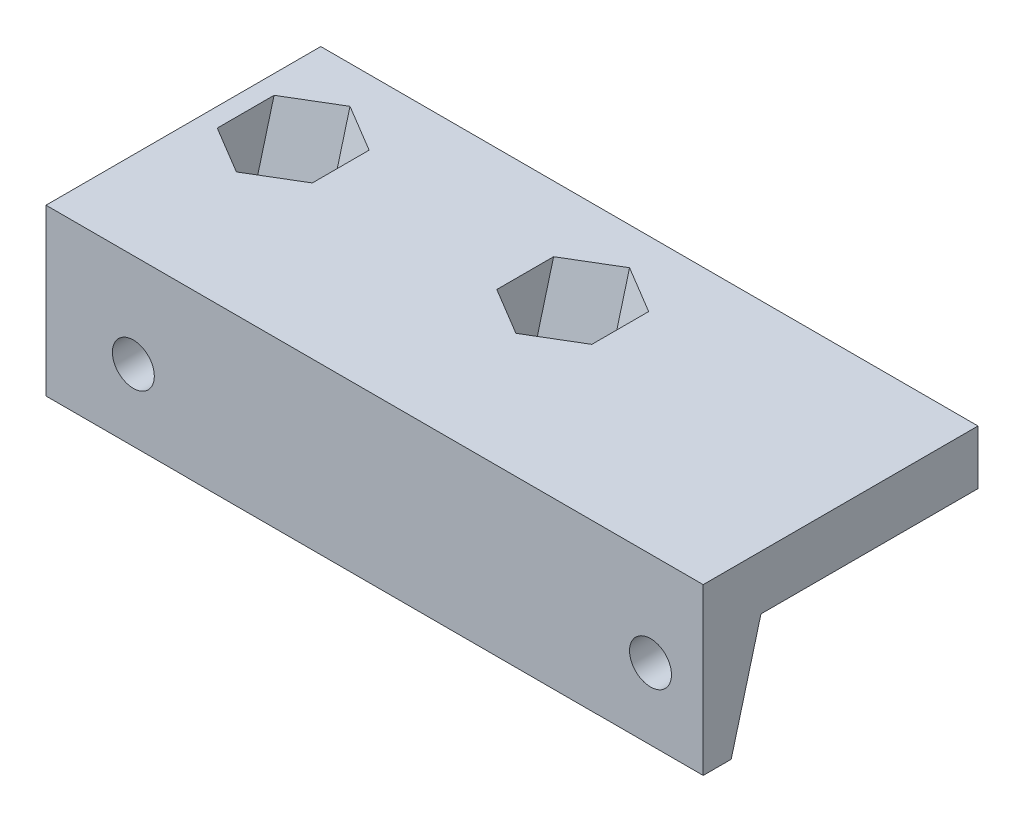
ISO-10303-21;
HEADER;
FILE_DESCRIPTION(('STEP AP214'),'2;1');
FILE_NAME('part.step','',(''),(''),'','','');
FILE_SCHEMA(('AUTOMOTIVE_DESIGN { 1 0 10303 214 1 1 1 1 }'));
ENDSEC;
DATA;
#1=APPLICATION_CONTEXT('core data for automotive mechanical design processes');
#2=APPLICATION_PROTOCOL_DEFINITION('international standard','automotive_design',2000,#1);
#3=PRODUCT_CONTEXT('',#1,'mechanical');
#4=PRODUCT('Part','Part','',(#3));
#5=PRODUCT_RELATED_PRODUCT_CATEGORY('part','',(#4));
#6=PRODUCT_DEFINITION_FORMATION('','',#4);
#7=PRODUCT_DEFINITION_CONTEXT('part definition',#1,'design');
#8=PRODUCT_DEFINITION('design','',#6,#7);
#9=PRODUCT_DEFINITION_SHAPE('','',#8);
#10=(LENGTH_UNIT() NAMED_UNIT(*) SI_UNIT(.MILLI.,.METRE.));
#11=(NAMED_UNIT(*) PLANE_ANGLE_UNIT() SI_UNIT($,.RADIAN.));
#12=(NAMED_UNIT(*) SI_UNIT($,.STERADIAN.) SOLID_ANGLE_UNIT());
#13=UNCERTAINTY_MEASURE_WITH_UNIT(LENGTH_MEASURE(1.E-05),#10,'distance_accuracy_value','');
#14=(GEOMETRIC_REPRESENTATION_CONTEXT(3) GLOBAL_UNCERTAINTY_ASSIGNED_CONTEXT((#13)) GLOBAL_UNIT_ASSIGNED_CONTEXT((#10,
#11,#12)) REPRESENTATION_CONTEXT('',''));
#15=CARTESIAN_POINT('',(0.,0.,0.));
#16=DIRECTION('',(0.,0.,1.));
#17=DIRECTION('',(1.,0.,0.));
#18=AXIS2_PLACEMENT_3D('',#15,#16,#17);
#19=CARTESIAN_POINT('',(-34.7500000000001,10.2662464495213,-12.2025071457582));
#20=DIRECTION('',(0.,-0.965925826289068,0.25881904510252));
#21=DIRECTION('',(0.,0.25881904510252,0.965925826289068));
#22=AXIS2_PLACEMENT_3D('',#19,#20,#21);
#23=CYLINDRICAL_SURFACE('',#22,2.);
#24=CARTESIAN_POINT('',(-34.75,-0.975363448323253,-9.190326852005));
#25=DIRECTION('',(0.,-0.965925826289068,0.25881904510252));
#26=DIRECTION('',(0.,-0.25881904510252,-0.965925826289068));
#27=AXIS2_PLACEMENT_3D('',#24,#25,#26);
#28=CIRCLE('',#27,2.);
#29=CARTESIAN_POINT('',(-34.75,-1.49300153852829,-11.1221785045831));
#30=VERTEX_POINT('',#29);
#31=EDGE_CURVE('E377',#30,#30,#28,.T.);
#32=ORIENTED_EDGE('',*,*,#31,.T.);
#33=EDGE_LOOP('',(#32));
#34=FACE_BOUND('',#33,.T.);
#35=CARTESIAN_POINT('',(-34.7500000000001,3.33145055141853,-10.3443341851869));
#36=DIRECTION('',(0.,-0.965925826289068,0.25881904510252));
#37=DIRECTION('',(0.,-0.25881904510252,-0.965925826289068));
#38=AXIS2_PLACEMENT_3D('',#35,#36,#37);
#39=CIRCLE('',#38,2.);
#40=CARTESIAN_POINT('',(-34.7500000000001,2.81381246121349,-12.276185837765));
#41=VERTEX_POINT('',#40);
#42=EDGE_CURVE('E312',#41,#41,#39,.T.);
#43=ORIENTED_EDGE('',*,*,#42,.F.);
#44=EDGE_LOOP('',(#43));
#45=FACE_BOUND('',#44,.T.);
#46=ADVANCED_FACE('F39',(#34,#45),#23,.F.);
#47=CARTESIAN_POINT('',(-14.7500000000001,10.2662464495213,-12.2025071457582));
#48=DIRECTION('',(0.,-0.965925826289068,0.25881904510252));
#49=DIRECTION('',(0.,0.25881904510252,0.965925826289068));
#50=AXIS2_PLACEMENT_3D('',#47,#48,#49);
#51=CYLINDRICAL_SURFACE('',#50,2.);
#52=CARTESIAN_POINT('',(-14.7500000000001,-0.975363448323243,-9.190326852005));
#53=DIRECTION('',(0.,-0.965925826289068,0.25881904510252));
#54=DIRECTION('',(0.,-0.25881904510252,-0.965925826289068));
#55=AXIS2_PLACEMENT_3D('',#52,#53,#54);
#56=CIRCLE('',#55,2.);
#57=CARTESIAN_POINT('',(-14.7500000000001,-1.49300153852828,-11.1221785045831));
#58=VERTEX_POINT('',#57);
#59=EDGE_CURVE('E380',#58,#58,#56,.T.);
#60=ORIENTED_EDGE('',*,*,#59,.T.);
#61=EDGE_LOOP('',(#60));
#62=FACE_BOUND('',#61,.T.);
#63=CARTESIAN_POINT('',(-14.7500000000001,3.33145055141854,-10.3443341851869));
#64=DIRECTION('',(0.,-0.965925826289068,0.25881904510252));
#65=DIRECTION('',(0.,-0.25881904510252,-0.965925826289068));
#66=AXIS2_PLACEMENT_3D('',#63,#64,#65);
#67=CIRCLE('',#66,2.);
#68=CARTESIAN_POINT('',(-14.7500000000001,2.8138124612135,-12.276185837765));
#69=VERTEX_POINT('',#68);
#70=EDGE_CURVE('E300',#69,#69,#67,.T.);
#71=ORIENTED_EDGE('',*,*,#70,.F.);
#72=EDGE_LOOP('',(#71));
#73=FACE_BOUND('',#72,.T.);
#74=ADVANCED_FACE('F441',(#62,#73),#51,.F.);
#75=CARTESIAN_POINT('',(-10.,12.2073892877902,-4.95806344859015));
#76=DIRECTION('',(0.,-0.25881904510252,-0.965925826289068));
#77=DIRECTION('',(0.,-0.965925826289068,0.25881904510252));
#78=AXIS2_PLACEMENT_3D('',#75,#76,#77);
#79=PLANE('',#78);
#80=CARTESIAN_POINT('',(3.74999999999994,6.27312353150435,-3.36798173152168));
#81=DIRECTION('',(0.,0.25881904510252,0.965925826289068));
#82=DIRECTION('',(0.,0.965925826289068,-0.25881904510252));
#83=AXIS2_PLACEMENT_3D('',#80,#81,#82);
#84=ELLIPSE('',#83,1.55291427061512,1.5);
#85=CARTESIAN_POINT('',(3.74999999999994,7.77312353150435,-3.76990552016836));
#86=VERTEX_POINT('',#85);
#87=EDGE_CURVE('E227',#86,#86,#84,.T.);
#88=ORIENTED_EDGE('',*,*,#87,.T.);
#89=EDGE_LOOP('',(#88));
#90=FACE_BOUND('',#89,.T.);
#91=DIRECTION('',(0.,-0.965925826289068,0.25881904510252));
#92=VECTOR('',#91,1.);
#93=CARTESIAN_POINT('',(7.51920912370846,-0.421775836808597,-1.5740888523746));
#94=LINE('',#93,#92);
#95=CARTESIAN_POINT('',(7.51920912370846,9.11771432346218,-4.13018753702379));
#96=VERTEX_POINT('',#95);
#97=CARTESIAN_POINT('',(7.51920912370846,1.17463517425132,-2.00184589357625));
#98=VERTEX_POINT('',#97);
#99=EDGE_CURVE('E329',#96,#98,#94,.T.);
#100=ORIENTED_EDGE('',*,*,#99,.T.);
#101=DIRECTION('',(-1.,0.,0.));
#102=VECTOR('',#101,1.);
#103=CARTESIAN_POINT('',(7.51920912370846,1.17463517425132,-2.00184589357625));
#104=LINE('',#103,#102);
#105=CARTESIAN_POINT('',(0.,1.17463517425132,-2.00184589357625));
#106=VERTEX_POINT('',#105);
#107=EDGE_CURVE('E326',#98,#106,#104,.T.);
#108=ORIENTED_EDGE('',*,*,#107,.T.);
#109=DIRECTION('',(0.,0.965925826289068,-0.25881904510252));
#110=VECTOR('',#109,1.);
#111=CARTESIAN_POINT('',(-5.99684705083167E-13,14.5521810124452,-5.58634849763062));
#112=LINE('',#111,#110);
#113=CARTESIAN_POINT('',(0.,1.16774620563937,-2.));
#114=VERTEX_POINT('',#113);
#115=EDGE_CURVE('E405',#114,#106,#112,.T.);
#116=ORIENTED_EDGE('',*,*,#115,.F.);
#117=DIRECTION('',(1.,0.,0.));
#118=VECTOR('',#117,1.);
#119=CARTESIAN_POINT('',(0.,1.16774620563937,-2.));
#120=LINE('',#119,#118);
#121=CARTESIAN_POINT('',(-10.,1.16774620563937,-2.));
#122=VERTEX_POINT('',#121);
#123=EDGE_CURVE('E418',#122,#114,#120,.T.);
#124=ORIENTED_EDGE('',*,*,#123,.F.);
#125=DIRECTION('',(0.,-0.965925826289068,0.25881904510252));
#126=VECTOR('',#125,1.);
#127=CARTESIAN_POINT('',(-10.,12.2073892877902,-4.95806344859015));
#128=LINE('',#127,#126);
#129=CARTESIAN_POINT('',(-10.,9.11771432346219,-4.13018753702379));
#130=VERTEX_POINT('',#129);
#131=EDGE_CURVE('E402',#130,#122,#128,.T.);
#132=ORIENTED_EDGE('',*,*,#131,.F.);
#133=DIRECTION('',(-1.,0.,0.));
#134=VECTOR('',#133,1.);
#135=CARTESIAN_POINT('',(23.5262830368964,9.11771432346221,-4.1301875370238));
#136=LINE('',#135,#134);
#137=EDGE_CURVE('E314',#96,#130,#136,.T.);
#138=ORIENTED_EDGE('',*,*,#137,.F.);
#139=EDGE_LOOP('',(#100,#108,#116,#124,#132,#138));
#140=FACE_BOUND('',#139,.T.);
#141=ADVANCED_FACE('F447',(#90,#140),#79,.T.);
#142=CARTESIAN_POINT('',(-10.,12.2073892877902,-4.95806344859015));
#143=DIRECTION('',(-1.,0.,0.));
#144=DIRECTION('',(0.,-1.,0.));
#145=AXIS2_PLACEMENT_3D('',#142,#143,#144);
#146=PLANE('',#145);
#147=DIRECTION('',(0.,0.,1.));
#148=VECTOR('',#147,1.);
#149=CARTESIAN_POINT('',(-10.,9.11771432346219,-4.95806344859015));
#150=LINE('',#149,#148);
#151=CARTESIAN_POINT('',(-10.,9.11771432346219,-19.659330243175));
#152=VERTEX_POINT('',#151);
#153=EDGE_CURVE('E308',#152,#130,#150,.T.);
#154=ORIENTED_EDGE('',*,*,#153,.T.);
#155=ORIENTED_EDGE('',*,*,#131,.T.);
#156=CARTESIAN_POINT('',(-10.,0.965779389945662,-1.94588315483698));
#157=VERTEX_POINT('',#156);
#158=EDGE_CURVE('E401',#122,#157,#128,.T.);
#159=ORIENTED_EDGE('',*,*,#158,.T.);
#160=DIRECTION('',(0.,0.25881904510252,0.965925826289068));
#161=VECTOR('',#160,1.);
#162=CARTESIAN_POINT('',(-10.,0.965779389945662,-1.94588315483698));
#163=LINE('',#162,#161);
#164=CARTESIAN_POINT('',(-10.,-2.91650628659214,-16.434770549173));
#165=VERTEX_POINT('',#164);
#166=EDGE_CURVE('E383',#165,#157,#163,.T.);
#167=ORIENTED_EDGE('',*,*,#166,.F.);
#168=DIRECTION('',(0.,-0.965925826289068,0.25881904510252));
#169=VECTOR('',#168,1.);
#170=CARTESIAN_POINT('',(-10.,8.32510361125244,-19.4469508429262));
#171=LINE('',#170,#169);
#172=EDGE_CURVE('E392',#152,#165,#171,.T.);
#173=ORIENTED_EDGE('',*,*,#172,.F.);
#174=EDGE_LOOP('',(#154,#155,#159,#167,#173));
#175=FACE_BOUND('',#174,.T.);
#176=ADVANCED_FACE('F471',(#175),#146,.F.);
#177=CARTESIAN_POINT('',(3.74999999999994,6.27312353150435,0.));
#178=DIRECTION('',(0.,0.,1.));
#179=DIRECTION('',(-1.,0.,0.));
#180=AXIS2_PLACEMENT_3D('',#177,#178,#179);
#181=PLANE('',#180);
#182=CARTESIAN_POINT('',(3.74999999999994,6.27312353150435,0.));
#183=DIRECTION('',(0.,0.,-1.));
#184=DIRECTION('',(-1.,0.,0.));
#185=AXIS2_PLACEMENT_3D('',#182,#183,#184);
#186=CIRCLE('',#185,1.5);
#187=CARTESIAN_POINT('',(2.24999999999994,6.27312353150435,0.));
#188=VERTEX_POINT('',#187);
#189=EDGE_CURVE('E43',#188,#188,#186,.T.);
#190=ORIENTED_EDGE('',*,*,#189,.T.);
#191=EDGE_LOOP('',(#190));
#192=FACE_BOUND('',#191,.T.);
#193=DIRECTION('',(0.,-1.,0.));
#194=VECTOR('',#193,1.);
#195=CARTESIAN_POINT('',(-29.5000000000001,1.16774620563936,0.));
#196=LINE('',#195,#194);
#197=CARTESIAN_POINT('',(-29.5000000000001,1.1746351742513,0.));
#198=VERTEX_POINT('',#197);
#199=CARTESIAN_POINT('',(-29.5000000000001,1.16774620563936,0.));
#200=VERTEX_POINT('',#199);
#201=EDGE_CURVE('E421',#198,#200,#196,.T.);
#202=ORIENTED_EDGE('',*,*,#201,.T.);
#203=DIRECTION('',(1.,0.,0.));
#204=VECTOR('',#203,1.);
#205=CARTESIAN_POINT('',(0.,1.16774620563937,0.));
#206=LINE('',#205,#204);
#207=CARTESIAN_POINT('',(0.,1.16774620563937,0.));
#208=VERTEX_POINT('',#207);
#209=EDGE_CURVE('E424',#200,#208,#206,.T.);
#210=ORIENTED_EDGE('',*,*,#209,.T.);
#211=DIRECTION('',(0.,1.,0.));
#212=VECTOR('',#211,1.);
#213=CARTESIAN_POINT('',(0.,2.52312353150435,0.));
#214=LINE('',#213,#212);
#215=CARTESIAN_POINT('',(0.,1.17463517425132,0.));
#216=VERTEX_POINT('',#215);
#217=EDGE_CURVE('E427',#208,#216,#214,.T.);
#218=ORIENTED_EDGE('',*,*,#217,.T.);
#219=DIRECTION('',(-1.,0.,0.));
#220=VECTOR('',#219,1.);
#221=CARTESIAN_POINT('',(7.51920912370846,1.17463517425132,0.));
#222=LINE('',#221,#220);
#223=CARTESIAN_POINT('',(7.51920912370846,1.17463517425132,0.));
#224=VERTEX_POINT('',#223);
#225=EDGE_CURVE('E321',#224,#216,#222,.T.);
#226=ORIENTED_EDGE('',*,*,#225,.F.);
#227=DIRECTION('',(0.,-1.,0.));
#228=VECTOR('',#227,1.);
#229=CARTESIAN_POINT('',(7.51920912370846,0.,0.));
#230=LINE('',#229,#228);
#231=CARTESIAN_POINT('',(7.51920912370845,13.,0.));
#232=VERTEX_POINT('',#231);
#233=EDGE_CURVE('E320',#232,#224,#230,.T.);
#234=ORIENTED_EDGE('',*,*,#233,.F.);
#235=DIRECTION('',(-1.,0.,0.));
#236=VECTOR('',#235,1.);
#237=CARTESIAN_POINT('',(-29.5000000000001,13.,0.));
#238=LINE('',#237,#236);
#239=CARTESIAN_POINT('',(-39.5000000000001,13.,0.));
#240=VERTEX_POINT('',#239);
#241=EDGE_CURVE('E414',#232,#240,#238,.T.);
#242=ORIENTED_EDGE('',*,*,#241,.T.);
#243=DIRECTION('',(0.,-1.,0.));
#244=VECTOR('',#243,1.);
#245=CARTESIAN_POINT('',(-39.5,0.,0.));
#246=LINE('',#245,#244);
#247=CARTESIAN_POINT('',(-39.5,1.1746351742513,0.));
#248=VERTEX_POINT('',#247);
#249=EDGE_CURVE('E337',#240,#248,#246,.T.);
#250=ORIENTED_EDGE('',*,*,#249,.T.);
#251=EDGE_CURVE('E325',#198,#248,#222,.T.);
#252=ORIENTED_EDGE('',*,*,#251,.F.);
#253=EDGE_LOOP('',(#202,#210,#218,#226,#234,#242,#250,#252));
#254=FACE_BOUND('',#253,.T.);
#255=CARTESIAN_POINT('',(-33.2500000000001,6.27312353150437,0.));
#256=DIRECTION('',(0.,0.,1.));
#257=DIRECTION('',(1.,0.,0.));
#258=AXIS2_PLACEMENT_3D('',#255,#256,#257);
#259=CIRCLE('',#258,1.5);
#260=CARTESIAN_POINT('',(-31.7500000000001,6.27312353150437,0.));
#261=VERTEX_POINT('',#260);
#262=EDGE_CURVE('E411',#261,#261,#259,.T.);
#263=ORIENTED_EDGE('',*,*,#262,.F.);
#264=EDGE_LOOP('',(#263));
#265=FACE_BOUND('',#264,.T.);
#266=ADVANCED_FACE('F474',(#192,#254,#265),#181,.T.);
#267=CARTESIAN_POINT('',(-29.5000000000001,13.,-2.));
#268=DIRECTION('',(0.,-1.,0.));
#269=DIRECTION('',(1.,0.,0.));
#270=AXIS2_PLACEMENT_3D('',#267,#268,#269);
#271=PLANE('',#270);
#272=DIRECTION('',(0.,0.,-1.));
#273=VECTOR('',#272,1.);
#274=CARTESIAN_POINT('',(-11.3500000000001,13.,-2.));
#275=LINE('',#274,#273);
#276=CARTESIAN_POINT('',(-11.3500000000001,13.,-10.9027764650004));
#277=VERTEX_POINT('',#276);
#278=CARTESIAN_POINT('',(-11.3500000000001,13.,-14.9672519388289));
#279=VERTEX_POINT('',#278);
#280=EDGE_CURVE('E283',#277,#279,#275,.T.);
#281=ORIENTED_EDGE('',*,*,#280,.F.);
#282=DIRECTION('',(0.858356263574049,0.,-0.513054114868206));
#283=VECTOR('',#282,1.);
#284=CARTESIAN_POINT('',(-28.6431081799039,13.,-0.566392043900022));
#285=LINE('',#284,#283);
#286=CARTESIAN_POINT('',(-14.7500000000001,13.,-8.87053872808612));
#287=VERTEX_POINT('',#286);
#288=EDGE_CURVE('E286',#287,#277,#285,.T.);
#289=ORIENTED_EDGE('',*,*,#288,.F.);
#290=DIRECTION('',(0.858356263574049,0.,0.513054114868206));
#291=VECTOR('',#290,1.);
#292=CARTESIAN_POINT('',(-22.5917683389919,13.,-13.5576968288622));
#293=LINE('',#292,#291);
#294=CARTESIAN_POINT('',(-18.1500000000001,13.,-10.9027764650004));
#295=VERTEX_POINT('',#294);
#296=EDGE_CURVE('E289',#295,#287,#293,.T.);
#297=ORIENTED_EDGE('',*,*,#296,.F.);
#298=DIRECTION('',(0.,0.,1.));
#299=VECTOR('',#298,1.);
#300=CARTESIAN_POINT('',(-18.1500000000001,13.,-2.));
#301=LINE('',#300,#299);
#302=CARTESIAN_POINT('',(-18.1500000000001,13.,-14.9672519388289));
#303=VERTEX_POINT('',#302);
#304=EDGE_CURVE('E292',#303,#295,#301,.T.);
#305=ORIENTED_EDGE('',*,*,#304,.F.);
#306=DIRECTION('',(-0.858356263574048,0.,0.513054114868206));
#307=VECTOR('',#306,1.);
#308=CARTESIAN_POINT('',(-32.2229617169554,13.,-6.55560374137409));
#309=LINE('',#308,#307);
#310=CARTESIAN_POINT('',(-14.7500000000001,13.,-16.9994896757431));
#311=VERTEX_POINT('',#310);
#312=EDGE_CURVE('E295',#311,#303,#309,.T.);
#313=ORIENTED_EDGE('',*,*,#312,.F.);
#314=DIRECTION('',(-0.858356263574049,0.,-0.513054114868206));
#315=VECTOR('',#314,1.);
#316=CARTESIAN_POINT('',(-19.0119148019403,13.,-19.5469085263362));
#317=LINE('',#316,#315);
#318=EDGE_CURVE('E298',#279,#311,#317,.T.);
#319=ORIENTED_EDGE('',*,*,#318,.F.);
#320=EDGE_LOOP('',(#281,#289,#297,#305,#313,#319));
#321=FACE_BOUND('',#320,.T.);
#322=DIRECTION('',(0.858356263574049,0.,-0.513054114868206));
#323=VECTOR('',#322,1.);
#324=CARTESIAN_POINT('',(-33.9075986755679,13.,-9.37405630489131));
#325=LINE('',#324,#323);
#326=CARTESIAN_POINT('',(-34.7500000000001,13.,-8.87053872808613));
#327=VERTEX_POINT('',#326);
#328=CARTESIAN_POINT('',(-31.3500000000001,13.,-10.9027764650004));
#329=VERTEX_POINT('',#328);
#330=EDGE_CURVE('E249',#327,#329,#325,.T.);
#331=ORIENTED_EDGE('',*,*,#330,.F.);
#332=DIRECTION('',(0.858356263574049,0.,0.513054114868205));
#333=VECTOR('',#332,1.);
#334=CARTESIAN_POINT('',(-27.8562588346558,13.,-4.75003256787089));
#335=LINE('',#334,#333);
#336=CARTESIAN_POINT('',(-38.1500000000001,13.,-10.9027764650004));
#337=VERTEX_POINT('',#336);
#338=EDGE_CURVE('E268',#337,#327,#335,.T.);
#339=ORIENTED_EDGE('',*,*,#338,.F.);
#340=DIRECTION('',(0.,0.,1.));
#341=VECTOR('',#340,1.);
#342=CARTESIAN_POINT('',(-38.1500000000001,13.,-2.));
#343=LINE('',#342,#341);
#344=CARTESIAN_POINT('',(-38.1500000000001,13.,-14.9672519388289));
#345=VERTEX_POINT('',#344);
#346=EDGE_CURVE('E271',#345,#337,#343,.T.);
#347=ORIENTED_EDGE('',*,*,#346,.F.);
#348=DIRECTION('',(-0.858356263574048,0.,0.513054114868207));
#349=VECTOR('',#348,1.);
#350=CARTESIAN_POINT('',(-37.4874522126194,13.,-15.3632680023654));
#351=LINE('',#350,#349);
#352=CARTESIAN_POINT('',(-34.7500000000001,13.,-16.9994896757431));
#353=VERTEX_POINT('',#352);
#354=EDGE_CURVE('E274',#353,#345,#351,.T.);
#355=ORIENTED_EDGE('',*,*,#354,.F.);
#356=DIRECTION('',(-0.858356263574049,0.,-0.513054114868206));
#357=VECTOR('',#356,1.);
#358=CARTESIAN_POINT('',(-24.2764052976043,13.,-10.739244265345));
#359=LINE('',#358,#357);
#360=CARTESIAN_POINT('',(-31.3500000000001,13.,-14.9672519388289));
#361=VERTEX_POINT('',#360);
#362=EDGE_CURVE('E277',#361,#353,#359,.T.);
#363=ORIENTED_EDGE('',*,*,#362,.F.);
#364=DIRECTION('',(0.,0.,-1.));
#365=VECTOR('',#364,1.);
#366=CARTESIAN_POINT('',(-31.3500000000001,13.,-2.));
#367=LINE('',#366,#365);
#368=EDGE_CURVE('E280',#329,#361,#367,.T.);
#369=ORIENTED_EDGE('',*,*,#368,.F.);
#370=EDGE_LOOP('',(#331,#339,#347,#355,#363,#369));
#371=FACE_BOUND('',#370,.T.);
#372=ORIENTED_EDGE('',*,*,#241,.F.);
#373=DIRECTION('',(0.,0.,1.));
#374=VECTOR('',#373,1.);
#375=CARTESIAN_POINT('',(7.51920912370845,13.,0.));
#376=LINE('',#375,#374);
#377=CARTESIAN_POINT('',(7.51920912370846,13.,-19.659330243175));
#378=VERTEX_POINT('',#377);
#379=EDGE_CURVE('E324',#378,#232,#376,.T.);
#380=ORIENTED_EDGE('',*,*,#379,.F.);
#381=DIRECTION('',(-1.,0.,0.));
#382=VECTOR('',#381,1.);
#383=CARTESIAN_POINT('',(23.5262830368964,13.,-19.659330243175));
#384=LINE('',#383,#382);
#385=CARTESIAN_POINT('',(-39.5000000000001,13.,-19.659330243175));
#386=VERTEX_POINT('',#385);
#387=EDGE_CURVE('E311',#378,#386,#384,.T.);
#388=ORIENTED_EDGE('',*,*,#387,.T.);
#389=DIRECTION('',(0.,0.,1.));
#390=VECTOR('',#389,1.);
#391=CARTESIAN_POINT('',(-39.5000000000001,13.,0.));
#392=LINE('',#391,#390);
#393=EDGE_CURVE('E331',#386,#240,#392,.T.);
#394=ORIENTED_EDGE('',*,*,#393,.T.);
#395=EDGE_LOOP('',(#372,#380,#388,#394));
#396=FACE_BOUND('',#395,.T.);
#397=ADVANCED_FACE('F41',(#321,#371,#396),#271,.F.);
#398=CARTESIAN_POINT('',(-29.5000000000001,1.16774620563936,-2.));
#399=DIRECTION('',(1.,0.,0.));
#400=DIRECTION('',(0.,0.,1.));
#401=AXIS2_PLACEMENT_3D('',#398,#399,#400);
#402=PLANE('',#401);
#403=DIRECTION('',(0.,-0.965925826289068,0.25881904510252));
#404=VECTOR('',#403,1.);
#405=CARTESIAN_POINT('',(-29.5000000000001,13.2875967515564,-5.24750416616437));
#406=LINE('',#405,#404);
#407=CARTESIAN_POINT('',(-29.5000000000001,1.1746351742513,-2.00184589357625));
#408=VERTEX_POINT('',#407);
#409=CARTESIAN_POINT('',(-29.5000000000001,1.16774620563936,-2.));
#410=VERTEX_POINT('',#409);
#411=EDGE_CURVE('E408',#408,#410,#406,.T.);
#412=ORIENTED_EDGE('',*,*,#411,.T.);
#413=DIRECTION('',(0.,0.,1.));
#414=VECTOR('',#413,1.);
#415=CARTESIAN_POINT('',(-29.5000000000001,1.16774620563936,-2.));
#416=LINE('',#415,#414);
#417=EDGE_CURVE('E48',#410,#200,#416,.T.);
#418=ORIENTED_EDGE('',*,*,#417,.T.);
#419=ORIENTED_EDGE('',*,*,#201,.F.);
#420=DIRECTION('',(0.,0.,1.));
#421=VECTOR('',#420,1.);
#422=CARTESIAN_POINT('',(-29.5000000000001,1.1746351742513,-2.));
#423=LINE('',#422,#421);
#424=EDGE_CURVE('E348',#408,#198,#423,.T.);
#425=ORIENTED_EDGE('',*,*,#424,.F.);
#426=EDGE_LOOP('',(#412,#418,#419,#425));
#427=FACE_BOUND('',#426,.T.);
#428=ADVANCED_FACE('F491',(#427),#402,.F.);
#429=CARTESIAN_POINT('',(0.,1.16774620563937,-2.));
#430=DIRECTION('',(0.,1.,0.));
#431=DIRECTION('',(-1.,0.,0.));
#432=AXIS2_PLACEMENT_3D('',#429,#430,#431);
#433=PLANE('',#432);
#434=ORIENTED_EDGE('',*,*,#209,.F.);
#435=ORIENTED_EDGE('',*,*,#417,.F.);
#436=EDGE_CURVE('E415',#410,#122,#120,.T.);
#437=ORIENTED_EDGE('',*,*,#436,.T.);
#438=ORIENTED_EDGE('',*,*,#123,.T.);
#439=DIRECTION('',(0.,0.,1.));
#440=VECTOR('',#439,1.);
#441=CARTESIAN_POINT('',(0.,1.16774620563937,-2.));
#442=LINE('',#441,#440);
#443=EDGE_CURVE('E417',#114,#208,#442,.T.);
#444=ORIENTED_EDGE('',*,*,#443,.T.);
#445=EDGE_LOOP('',(#434,#435,#437,#438,#444));
#446=FACE_BOUND('',#445,.T.);
#447=ADVANCED_FACE('F488',(#446),#433,.F.);
#448=CARTESIAN_POINT('',(0.,2.52312353150435,-2.));
#449=DIRECTION('',(-1.,0.,0.));
#450=DIRECTION('',(0.,-1.,0.));
#451=AXIS2_PLACEMENT_3D('',#448,#449,#450);
#452=PLANE('',#451);
#453=ORIENTED_EDGE('',*,*,#217,.F.);
#454=ORIENTED_EDGE('',*,*,#443,.F.);
#455=ORIENTED_EDGE('',*,*,#115,.T.);
#456=DIRECTION('',(0.,0.,-1.));
#457=VECTOR('',#456,1.);
#458=CARTESIAN_POINT('',(0.,1.17463517425132,-2.));
#459=LINE('',#458,#457);
#460=EDGE_CURVE('E333',#216,#106,#459,.T.);
#461=ORIENTED_EDGE('',*,*,#460,.F.);
#462=EDGE_LOOP('',(#453,#454,#455,#461));
#463=FACE_BOUND('',#462,.T.);
#464=ADVANCED_FACE('F481',(#463),#452,.F.);
#465=CARTESIAN_POINT('',(-33.2500000000001,6.27312353150437,-2.));
#466=DIRECTION('',(0.,0.,1.));
#467=DIRECTION('',(-1.,0.,0.));
#468=AXIS2_PLACEMENT_3D('',#465,#466,#467);
#469=CYLINDRICAL_SURFACE('',#468,1.5);
#470=ORIENTED_EDGE('',*,*,#262,.T.);
#471=EDGE_LOOP('',(#470));
#472=FACE_BOUND('',#471,.T.);
#473=CARTESIAN_POINT('',(-33.2500000000001,6.27312353150437,-8.));
#474=DIRECTION('',(0.,0.,1.));
#475=DIRECTION('',(1.,0.,0.));
#476=AXIS2_PLACEMENT_3D('',#473,#474,#475);
#477=CIRCLE('',#476,1.5);
#478=CARTESIAN_POINT('',(-32.5875588135233,4.92732574786104,-8.));
#479=VERTEX_POINT('',#478);
#480=CARTESIAN_POINT('',(-33.8139592194803,7.66306957317764,-8.));
#481=VERTEX_POINT('',#480);
#482=EDGE_CURVE('E222',#479,#481,#477,.T.);
#483=ORIENTED_EDGE('',*,*,#482,.F.);
#484=CARTESIAN_POINT('',(-33.2500000000001,6.27312353150437,-7.96465308293685));
#485=DIRECTION('',(-0.5,-0.224143868042013,-0.836516303737808));
#486=DIRECTION('',(0.763325544034592,0.342189480030375,-0.547942034873065));
#487=AXIS2_PLACEMENT_3D('',#484,#485,#486);
#488=ELLIPSE('',#487,1.79315094433611,1.5);
#489=CARTESIAN_POINT('',(-34.7500000000001,6.27312353150436,-7.0680776107688));
#490=VERTEX_POINT('',#489);
#491=EDGE_CURVE('E218',#479,#490,#488,.T.);
#492=ORIENTED_EDGE('',*,*,#491,.T.);
#493=EDGE_CURVE('E216',#490,#481,#488,.T.);
#494=ORIENTED_EDGE('',*,*,#493,.T.);
#495=EDGE_LOOP('',(#483,#492,#494));
#496=FACE_BOUND('',#495,.T.);
#497=ADVANCED_FACE('F221',(#472,#496),#469,.F.);
#498=CARTESIAN_POINT('',(-10.,8.32510361125244,-19.4469508429262));
#499=DIRECTION('',(0.,0.25881904510252,0.965925826289068));
#500=DIRECTION('',(0.,0.965925826289068,-0.25881904510252));
#501=AXIS2_PLACEMENT_3D('',#498,#499,#500);
#502=PLANE('',#501);
#503=DIRECTION('',(1.,0.,0.));
#504=VECTOR('',#503,1.);
#505=CARTESIAN_POINT('',(-10.,-2.91650628659214,-16.434770549173));
#506=LINE('',#505,#504);
#507=CARTESIAN_POINT('',(-39.5,-2.91650628659216,-16.434770549173));
#508=VERTEX_POINT('',#507);
#509=EDGE_CURVE('E390',#508,#165,#506,.T.);
#510=ORIENTED_EDGE('',*,*,#509,.F.);
#511=DIRECTION('',(0.,-0.965925826289068,0.25881904510252));
#512=VECTOR('',#511,1.);
#513=CARTESIAN_POINT('',(-39.5000000000001,8.32510361125243,-19.4469508429262));
#514=LINE('',#513,#512);
#515=CARTESIAN_POINT('',(-39.5000000000001,9.11771432346217,-19.659330243175));
#516=VERTEX_POINT('',#515);
#517=EDGE_CURVE('E395',#516,#508,#514,.T.);
#518=ORIENTED_EDGE('',*,*,#517,.F.);
#519=DIRECTION('',(1.,0.,0.));
#520=VECTOR('',#519,1.);
#521=CARTESIAN_POINT('',(-10.,9.11771432346219,-19.659330243175));
#522=LINE('',#521,#520);
#523=EDGE_CURVE('E353',#516,#152,#522,.T.);
#524=ORIENTED_EDGE('',*,*,#523,.T.);
#525=ORIENTED_EDGE('',*,*,#172,.T.);
#526=EDGE_LOOP('',(#510,#518,#524,#525));
#527=FACE_BOUND('',#526,.T.);
#528=ADVANCED_FACE('F460',(#527),#502,.F.);
#529=CARTESIAN_POINT('',(-39.5000000000001,12.2073892877902,-4.95806344859015));
#530=DIRECTION('',(1.,0.,0.));
#531=DIRECTION('',(0.,1.,0.));
#532=AXIS2_PLACEMENT_3D('',#529,#530,#531);
#533=PLANE('',#532);
#534=ORIENTED_EDGE('',*,*,#517,.T.);
#535=DIRECTION('',(0.,-0.25881904510252,-0.965925826289068));
#536=VECTOR('',#535,1.);
#537=CARTESIAN_POINT('',(-39.5,0.965779389945648,-1.94588315483698));
#538=LINE('',#537,#536);
#539=CARTESIAN_POINT('',(-39.5,0.965779389945648,-1.94588315483698));
#540=VERTEX_POINT('',#539);
#541=EDGE_CURVE('E388',#540,#508,#538,.T.);
#542=ORIENTED_EDGE('',*,*,#541,.F.);
#543=DIRECTION('',(0.,-0.965925826289068,0.25881904510252));
#544=VECTOR('',#543,1.);
#545=CARTESIAN_POINT('',(-39.5000000000001,12.2073892877902,-4.95806344859015));
#546=LINE('',#545,#544);
#547=CARTESIAN_POINT('',(-39.5,1.1746351742513,-2.00184589357625));
#548=VERTEX_POINT('',#547);
#549=EDGE_CURVE('E398',#548,#540,#546,.T.);
#550=ORIENTED_EDGE('',*,*,#549,.F.);
#551=DIRECTION('',(0.,0.,-1.));
#552=VECTOR('',#551,1.);
#553=CARTESIAN_POINT('',(-39.5,1.1746351742513,0.));
#554=LINE('',#553,#552);
#555=EDGE_CURVE('E334',#248,#548,#554,.T.);
#556=ORIENTED_EDGE('',*,*,#555,.F.);
#557=ORIENTED_EDGE('',*,*,#249,.F.);
#558=ORIENTED_EDGE('',*,*,#393,.F.);
#559=DIRECTION('',(0.,1.,0.));
#560=VECTOR('',#559,1.);
#561=CARTESIAN_POINT('',(-39.5,0.,-19.659330243175));
#562=LINE('',#561,#560);
#563=EDGE_CURVE('E309',#516,#386,#562,.T.);
#564=ORIENTED_EDGE('',*,*,#563,.F.);
#565=EDGE_LOOP('',(#534,#542,#550,#556,#557,#558,#564));
#566=FACE_BOUND('',#565,.T.);
#567=ADVANCED_FACE('F458',(#566),#533,.F.);
#568=CARTESIAN_POINT('',(0.,1.38755522675427,-0.37179430246239));
#569=DIRECTION('',(0.,-0.965925826289068,0.25881904510252));
#570=DIRECTION('',(0.,0.25881904510252,0.965925826289068));
#571=AXIS2_PLACEMENT_3D('',#568,#569,#570);
#572=PLANE('',#571);
#573=ORIENTED_EDGE('',*,*,#59,.F.);
#574=EDGE_LOOP('',(#573));
#575=FACE_BOUND('',#574,.T.);
#576=ORIENTED_EDGE('',*,*,#166,.T.);
#577=DIRECTION('',(-1.,0.,0.));
#578=VECTOR('',#577,1.);
#579=CARTESIAN_POINT('',(-10.,0.965779389945662,-1.94588315483698));
#580=LINE('',#579,#578);
#581=EDGE_CURVE('E386',#157,#540,#580,.T.);
#582=ORIENTED_EDGE('',*,*,#581,.T.);
#583=ORIENTED_EDGE('',*,*,#541,.T.);
#584=ORIENTED_EDGE('',*,*,#509,.T.);
#585=EDGE_LOOP('',(#576,#582,#583,#584));
#586=FACE_BOUND('',#585,.T.);
#587=ORIENTED_EDGE('',*,*,#31,.F.);
#588=EDGE_LOOP('',(#587));
#589=FACE_BOUND('',#588,.T.);
#590=ADVANCED_FACE('F454',(#575,#586,#589),#572,.T.);
#591=CARTESIAN_POINT('',(-10.,12.2073892877902,-4.95806344859015));
#592=DIRECTION('',(0.,-0.25881904510252,-0.965925826289068));
#593=DIRECTION('',(0.,-0.965925826289068,0.25881904510252));
#594=AXIS2_PLACEMENT_3D('',#591,#592,#593);
#595=PLANE('',#594);
#596=ORIENTED_EDGE('',*,*,#549,.T.);
#597=ORIENTED_EDGE('',*,*,#581,.F.);
#598=ORIENTED_EDGE('',*,*,#158,.F.);
#599=ORIENTED_EDGE('',*,*,#436,.F.);
#600=ORIENTED_EDGE('',*,*,#411,.F.);
#601=EDGE_CURVE('E330',#408,#548,#104,.T.);
#602=ORIENTED_EDGE('',*,*,#601,.T.);
#603=EDGE_LOOP('',(#596,#597,#598,#599,#600,#602));
#604=FACE_BOUND('',#603,.T.);
#605=ADVANCED_FACE('F457',(#604),#595,.F.);
#606=CARTESIAN_POINT('',(7.51920912370846,1.17463517425132,0.));
#607=DIRECTION('',(0.,-1.,0.));
#608=DIRECTION('',(1.,0.,0.));
#609=AXIS2_PLACEMENT_3D('',#606,#607,#608);
#610=PLANE('',#609);
#611=ORIENTED_EDGE('',*,*,#424,.T.);
#612=ORIENTED_EDGE('',*,*,#251,.T.);
#613=ORIENTED_EDGE('',*,*,#555,.T.);
#614=ORIENTED_EDGE('',*,*,#601,.F.);
#615=EDGE_LOOP('',(#611,#612,#613,#614));
#616=FACE_BOUND('',#615,.T.);
#617=ADVANCED_FACE('F469',(#616),#610,.T.);
#618=ORIENTED_EDGE('',*,*,#460,.T.);
#619=ORIENTED_EDGE('',*,*,#107,.F.);
#620=DIRECTION('',(0.,0.,-1.));
#621=VECTOR('',#620,1.);
#622=CARTESIAN_POINT('',(7.51920912370846,1.17463517425132,0.));
#623=LINE('',#622,#621);
#624=EDGE_CURVE('E341',#224,#98,#623,.T.);
#625=ORIENTED_EDGE('',*,*,#624,.F.);
#626=ORIENTED_EDGE('',*,*,#225,.T.);
#627=EDGE_LOOP('',(#618,#619,#625,#626));
#628=FACE_BOUND('',#627,.T.);
#629=ADVANCED_FACE('F531',(#628),#610,.T.);
#630=CARTESIAN_POINT('',(7.51920912370846,0.,0.));
#631=DIRECTION('',(-1.,0.,0.));
#632=DIRECTION('',(0.,-1.,0.));
#633=AXIS2_PLACEMENT_3D('',#630,#631,#632);
#634=PLANE('',#633);
#635=ORIENTED_EDGE('',*,*,#233,.T.);
#636=ORIENTED_EDGE('',*,*,#624,.T.);
#637=ORIENTED_EDGE('',*,*,#99,.F.);
#638=DIRECTION('',(0.,0.,-1.));
#639=VECTOR('',#638,1.);
#640=CARTESIAN_POINT('',(7.51920912370846,9.1177143234622,0.));
#641=LINE('',#640,#639);
#642=CARTESIAN_POINT('',(7.51920912370846,9.1177143234622,-19.659330243175));
#643=VERTEX_POINT('',#642);
#644=EDGE_CURVE('E301',#96,#643,#641,.T.);
#645=ORIENTED_EDGE('',*,*,#644,.T.);
#646=DIRECTION('',(0.,-1.,0.));
#647=VECTOR('',#646,1.);
#648=CARTESIAN_POINT('',(7.51920912370846,0.,-19.659330243175));
#649=LINE('',#648,#647);
#650=EDGE_CURVE('E304',#378,#643,#649,.T.);
#651=ORIENTED_EDGE('',*,*,#650,.F.);
#652=ORIENTED_EDGE('',*,*,#379,.T.);
#653=EDGE_LOOP('',(#635,#636,#637,#645,#651,#652));
#654=FACE_BOUND('',#653,.T.);
#655=ADVANCED_FACE('F534',(#654),#634,.F.);
#656=CARTESIAN_POINT('',(23.5262830368964,0.,-19.659330243175));
#657=DIRECTION('',(0.,0.,-1.));
#658=DIRECTION('',(1.,0.,0.));
#659=AXIS2_PLACEMENT_3D('',#656,#657,#658);
#660=PLANE('',#659);
#661=ORIENTED_EDGE('',*,*,#650,.T.);
#662=DIRECTION('',(-1.,0.,0.));
#663=VECTOR('',#662,1.);
#664=CARTESIAN_POINT('',(23.5262830368964,9.1177143234622,-19.659330243175));
#665=LINE('',#664,#663);
#666=EDGE_CURVE('E305',#643,#152,#665,.T.);
#667=ORIENTED_EDGE('',*,*,#666,.T.);
#668=ORIENTED_EDGE('',*,*,#523,.F.);
#669=ORIENTED_EDGE('',*,*,#563,.T.);
#670=ORIENTED_EDGE('',*,*,#387,.F.);
#671=EDGE_LOOP('',(#661,#667,#668,#669,#670));
#672=FACE_BOUND('',#671,.T.);
#673=ADVANCED_FACE('F543',(#672),#660,.T.);
#674=CARTESIAN_POINT('',(23.5262830368964,9.11771432346221,0.));
#675=DIRECTION('',(0.,1.,0.));
#676=DIRECTION('',(-1.,0.,0.));
#677=AXIS2_PLACEMENT_3D('',#674,#675,#676);
#678=PLANE('',#677);
#679=ORIENTED_EDGE('',*,*,#666,.F.);
#680=ORIENTED_EDGE('',*,*,#644,.F.);
#681=ORIENTED_EDGE('',*,*,#137,.T.);
#682=ORIENTED_EDGE('',*,*,#153,.F.);
#683=EDGE_LOOP('',(#679,#680,#681,#682));
#684=FACE_BOUND('',#683,.T.);
#685=ADVANCED_FACE('F545',(#684),#678,.F.);
#686=CARTESIAN_POINT('',(0.,5.69436922649606,-1.52580163564425));
#687=DIRECTION('',(0.,0.965925826289068,-0.25881904510252));
#688=DIRECTION('',(0.,-0.25881904510252,-0.965925826289068));
#689=AXIS2_PLACEMENT_3D('',#686,#687,#688);
#690=PLANE('',#689);
#691=ORIENTED_EDGE('',*,*,#70,.T.);
#692=EDGE_LOOP('',(#691));
#693=FACE_BOUND('',#692,.T.);
#694=DIRECTION('',(0.866025403784439,0.129409522551261,0.482962913144534));
#695=VECTOR('',#694,1.);
#696=CARTESIAN_POINT('',(-14.7500000000001,2.31533168296142,-14.1365414287983));
#697=LINE('',#696,#695);
#698=CARTESIAN_POINT('',(-14.7500000000001,2.31533168296142,-14.1365414287983));
#699=VERTEX_POINT('',#698);
#700=CARTESIAN_POINT('',(-11.35,2.82339111718998,-12.2404378069926));
#701=VERTEX_POINT('',#700);
#702=EDGE_CURVE('E231',#699,#701,#697,.T.);
#703=ORIENTED_EDGE('',*,*,#702,.F.);
#704=DIRECTION('',(0.866025403784438,-0.12940952255126,-0.482962913144535));
#705=VECTOR('',#704,1.);
#706=CARTESIAN_POINT('',(-18.1500000000001,2.82339111718998,-12.2404378069926));
#707=LINE('',#706,#705);
#708=CARTESIAN_POINT('',(-18.1500000000001,2.82339111718998,-12.2404378069926));
#709=VERTEX_POINT('',#708);
#710=EDGE_CURVE('E246',#709,#699,#707,.T.);
#711=ORIENTED_EDGE('',*,*,#710,.F.);
#712=DIRECTION('',(0.,-0.25881904510252,-0.965925826289068));
#713=VECTOR('',#712,1.);
#714=CARTESIAN_POINT('',(-18.1500000000001,3.83950998564711,-8.44823056338116));
#715=LINE('',#714,#713);
#716=CARTESIAN_POINT('',(-18.1500000000001,3.83950998564711,-8.44823056338116));
#717=VERTEX_POINT('',#716);
#718=EDGE_CURVE('E243',#717,#709,#715,.T.);
#719=ORIENTED_EDGE('',*,*,#718,.F.);
#720=DIRECTION('',(-0.866025403784439,-0.129409522551261,-0.482962913144534));
#721=VECTOR('',#720,1.);
#722=CARTESIAN_POINT('',(-14.7500000000001,4.34756941987567,-6.55212694157546));
#723=LINE('',#722,#721);
#724=CARTESIAN_POINT('',(-14.7500000000001,4.34756941987567,-6.55212694157546));
#725=VERTEX_POINT('',#724);
#726=EDGE_CURVE('E240',#725,#717,#723,.T.);
#727=ORIENTED_EDGE('',*,*,#726,.F.);
#728=DIRECTION('',(-0.866025403784439,0.12940952255126,0.482962913144534));
#729=VECTOR('',#728,1.);
#730=CARTESIAN_POINT('',(-11.35,3.83950998564711,-8.44823056338116));
#731=LINE('',#730,#729);
#732=CARTESIAN_POINT('',(-11.35,3.83950998564711,-8.44823056338116));
#733=VERTEX_POINT('',#732);
#734=EDGE_CURVE('E237',#733,#725,#731,.T.);
#735=ORIENTED_EDGE('',*,*,#734,.F.);
#736=DIRECTION('',(0.,0.25881904510252,0.965925826289068));
#737=VECTOR('',#736,1.);
#738=CARTESIAN_POINT('',(-11.35,2.82339111718998,-12.2404378069926));
#739=LINE('',#738,#737);
#740=EDGE_CURVE('E233',#701,#733,#739,.T.);
#741=ORIENTED_EDGE('',*,*,#740,.F.);
#742=EDGE_LOOP('',(#703,#711,#719,#727,#735,#741));
#743=FACE_BOUND('',#742,.T.);
#744=ADVANCED_FACE('F547',(#693,#743),#690,.T.);
#745=CARTESIAN_POINT('',(0.,5.69436922649604,-1.52580163564425));
#746=DIRECTION('',(0.,0.965925826289068,-0.25881904510252));
#747=DIRECTION('',(0.,-0.25881904510252,-0.965925826289068));
#748=AXIS2_PLACEMENT_3D('',#745,#746,#747);
#749=PLANE('',#748);
#750=ORIENTED_EDGE('',*,*,#42,.T.);
#751=EDGE_LOOP('',(#750));
#752=FACE_BOUND('',#751,.T.);
#753=DIRECTION('',(0.,0.25881904510252,0.965925826289068));
#754=VECTOR('',#753,1.);
#755=CARTESIAN_POINT('',(-31.3500000000001,2.82339111718998,-12.2404378069925));
#756=LINE('',#755,#754);
#757=CARTESIAN_POINT('',(-31.3500000000001,2.82339111718998,-12.2404378069925));
#758=VERTEX_POINT('',#757);
#759=CARTESIAN_POINT('',(-31.3500000000001,3.8395099856471,-8.44823056338116));
#760=VERTEX_POINT('',#759);
#761=EDGE_CURVE('E230',#758,#760,#756,.T.);
#762=ORIENTED_EDGE('',*,*,#761,.F.);
#763=DIRECTION('',(0.866025403784439,0.12940952255126,0.482962913144534));
#764=VECTOR('',#763,1.);
#765=CARTESIAN_POINT('',(-34.7500000000001,2.31533168296141,-14.1365414287982));
#766=LINE('',#765,#764);
#767=CARTESIAN_POINT('',(-34.7500000000001,2.31533168296141,-14.1365414287982));
#768=VERTEX_POINT('',#767);
#769=EDGE_CURVE('E234',#768,#758,#766,.T.);
#770=ORIENTED_EDGE('',*,*,#769,.F.);
#771=DIRECTION('',(0.866025403784438,-0.129409522551259,-0.482962913144535));
#772=VECTOR('',#771,1.);
#773=CARTESIAN_POINT('',(-38.1500000000001,2.82339111718997,-12.2404378069925));
#774=LINE('',#773,#772);
#775=CARTESIAN_POINT('',(-38.1500000000001,2.82339111718997,-12.2404378069925));
#776=VERTEX_POINT('',#775);
#777=EDGE_CURVE('E261',#776,#768,#774,.T.);
#778=ORIENTED_EDGE('',*,*,#777,.F.);
#779=DIRECTION('',(0.,-0.258819045102521,-0.965925826289068));
#780=VECTOR('',#779,1.);
#781=CARTESIAN_POINT('',(-38.1500000000001,3.8395099856471,-8.44823056338116));
#782=LINE('',#781,#780);
#783=CARTESIAN_POINT('',(-38.1500000000001,3.8395099856471,-8.44823056338116));
#784=VERTEX_POINT('',#783);
#785=EDGE_CURVE('E258',#784,#776,#782,.T.);
#786=ORIENTED_EDGE('',*,*,#785,.F.);
#787=DIRECTION('',(-0.866025403784439,-0.129409522551261,-0.482962913144534));
#788=VECTOR('',#787,1.);
#789=CARTESIAN_POINT('',(-34.75,4.34756941987566,-6.55212694157546));
#790=LINE('',#789,#788);
#791=CARTESIAN_POINT('',(-34.75,4.34756941987566,-6.55212694157546));
#792=VERTEX_POINT('',#791);
#793=EDGE_CURVE('E255',#792,#784,#790,.T.);
#794=ORIENTED_EDGE('',*,*,#793,.F.);
#795=DIRECTION('',(-0.866025403784439,0.12940952255126,0.482962913144534));
#796=VECTOR('',#795,1.);
#797=CARTESIAN_POINT('',(-31.3500000000001,3.8395099856471,-8.44823056338116));
#798=LINE('',#797,#796);
#799=EDGE_CURVE('E252',#760,#792,#798,.T.);
#800=ORIENTED_EDGE('',*,*,#799,.F.);
#801=EDGE_LOOP('',(#762,#770,#778,#786,#794,#800));
#802=FACE_BOUND('',#801,.T.);
#803=ADVANCED_FACE('F437',(#752,#802),#749,.T.);
#804=CARTESIAN_POINT('',(-31.3500000000001,7.70321329080337,-9.48350674379124));
#805=DIRECTION('',(0.5,0.224143868042013,0.836516303737808));
#806=DIRECTION('',(-0.858356263574049,0.,0.513054114868206));
#807=AXIS2_PLACEMENT_3D('',#804,#805,#806);
#808=PLANE('',#807);
#809=DIRECTION('',(0.409064926172233,-0.912505280081001,0.));
#810=VECTOR('',#809,1.);
#811=CARTESIAN_POINT('',(-33.4166393892299,6.77676419770344,-8.));
#812=LINE('',#811,#810);
#813=EDGE_CURVE('E11',#481,#479,#812,.T.);
#814=ORIENTED_EDGE('',*,*,#813,.F.);
#815=ORIENTED_EDGE('',*,*,#493,.F.);
#816=DIRECTION('',(0.,0.965925826289068,-0.25881904510252));
#817=VECTOR('',#816,1.);
#818=CARTESIAN_POINT('',(-34.7500000000001,8.21127272503194,-7.58740312198554));
#819=LINE('',#818,#817);
#820=EDGE_CURVE('E373',#490,#327,#819,.T.);
#821=ORIENTED_EDGE('',*,*,#820,.T.);
#822=ORIENTED_EDGE('',*,*,#330,.T.);
#823=DIRECTION('',(0.,0.965925826289068,-0.25881904510252));
#824=VECTOR('',#823,1.);
#825=CARTESIAN_POINT('',(-31.3500000000001,7.70321329080337,-9.48350674379124));
#826=LINE('',#825,#824);
#827=EDGE_CURVE('E350',#760,#329,#826,.T.);
#828=ORIENTED_EDGE('',*,*,#827,.F.);
#829=ORIENTED_EDGE('',*,*,#799,.T.);
#830=EDGE_CURVE('E371',#792,#490,#819,.T.);
#831=ORIENTED_EDGE('',*,*,#830,.T.);
#832=ORIENTED_EDGE('',*,*,#491,.F.);
#833=EDGE_LOOP('',(#814,#815,#821,#822,#828,#829,#831,#832));
#834=FACE_BOUND('',#833,.T.);
#835=ADVANCED_FACE('F215',(#834),#808,.F.);
#836=CARTESIAN_POINT('',(-34.7500000000001,8.21127272503194,-7.58740312198554));
#837=DIRECTION('',(-0.5,0.224143868042013,0.836516303737808));
#838=DIRECTION('',(-0.858356263574049,0.,-0.513054114868205));
#839=AXIS2_PLACEMENT_3D('',#836,#837,#838);
#840=PLANE('',#839);
#841=ORIENTED_EDGE('',*,*,#830,.F.);
#842=ORIENTED_EDGE('',*,*,#793,.T.);
#843=DIRECTION('',(0.,0.965925826289068,-0.25881904510252));
#844=VECTOR('',#843,1.);
#845=CARTESIAN_POINT('',(-38.1500000000001,7.70321329080337,-9.48350674379124));
#846=LINE('',#845,#844);
#847=EDGE_CURVE('E369',#784,#337,#846,.T.);
#848=ORIENTED_EDGE('',*,*,#847,.T.);
#849=ORIENTED_EDGE('',*,*,#338,.T.);
#850=ORIENTED_EDGE('',*,*,#820,.F.);
#851=EDGE_LOOP('',(#841,#842,#848,#849,#850));
#852=FACE_BOUND('',#851,.T.);
#853=ADVANCED_FACE('F596',(#852),#840,.F.);
#854=CARTESIAN_POINT('',(-38.1500000000001,7.70321329080337,-9.48350674379124));
#855=DIRECTION('',(-1.,0.,0.));
#856=DIRECTION('',(0.,-1.,0.));
#857=AXIS2_PLACEMENT_3D('',#854,#855,#856);
#858=PLANE('',#857);
#859=ORIENTED_EDGE('',*,*,#847,.F.);
#860=ORIENTED_EDGE('',*,*,#785,.T.);
#861=DIRECTION('',(0.,0.965925826289068,-0.25881904510252));
#862=VECTOR('',#861,1.);
#863=CARTESIAN_POINT('',(-38.1500000000001,6.68709442234625,-13.2757139874026));
#864=LINE('',#863,#862);
#865=EDGE_CURVE('E367',#776,#345,#864,.T.);
#866=ORIENTED_EDGE('',*,*,#865,.T.);
#867=ORIENTED_EDGE('',*,*,#346,.T.);
#868=EDGE_LOOP('',(#859,#860,#866,#867));
#869=FACE_BOUND('',#868,.T.);
#870=ADVANCED_FACE('F592',(#869),#858,.F.);
#871=CARTESIAN_POINT('',(-38.1500000000001,6.68709442234625,-13.2757139874026));
#872=DIRECTION('',(-0.500000000000001,-0.224143868042013,-0.836516303737808));
#873=DIRECTION('',(0.858356263574048,0.,-0.513054114868207));
#874=AXIS2_PLACEMENT_3D('',#871,#872,#873);
#875=PLANE('',#874);
#876=ORIENTED_EDGE('',*,*,#865,.F.);
#877=ORIENTED_EDGE('',*,*,#777,.T.);
#878=DIRECTION('',(0.,0.965925826289068,-0.25881904510252));
#879=VECTOR('',#878,1.);
#880=CARTESIAN_POINT('',(-34.7500000000001,6.17903498811769,-15.1718176092083));
#881=LINE('',#880,#879);
#882=EDGE_CURVE('E365',#768,#353,#881,.T.);
#883=ORIENTED_EDGE('',*,*,#882,.T.);
#884=ORIENTED_EDGE('',*,*,#354,.T.);
#885=EDGE_LOOP('',(#876,#877,#883,#884));
#886=FACE_BOUND('',#885,.T.);
#887=ADVANCED_FACE('F588',(#886),#875,.F.);
#888=CARTESIAN_POINT('',(-34.7500000000001,6.17903498811769,-15.1718176092083));
#889=DIRECTION('',(0.5,-0.224143868042013,-0.836516303737808));
#890=DIRECTION('',(0.858356263574049,0.,0.513054114868206));
#891=AXIS2_PLACEMENT_3D('',#888,#889,#890);
#892=PLANE('',#891);
#893=ORIENTED_EDGE('',*,*,#882,.F.);
#894=ORIENTED_EDGE('',*,*,#769,.T.);
#895=DIRECTION('',(0.,0.965925826289068,-0.25881904510252));
#896=VECTOR('',#895,1.);
#897=CARTESIAN_POINT('',(-31.3500000000001,6.68709442234625,-13.2757139874026));
#898=LINE('',#897,#896);
#899=EDGE_CURVE('E363',#758,#361,#898,.T.);
#900=ORIENTED_EDGE('',*,*,#899,.T.);
#901=ORIENTED_EDGE('',*,*,#362,.T.);
#902=EDGE_LOOP('',(#893,#894,#900,#901));
#903=FACE_BOUND('',#902,.T.);
#904=ADVANCED_FACE('F585',(#903),#892,.F.);
#905=CARTESIAN_POINT('',(-31.3500000000001,6.68709442234625,-13.2757139874026));
#906=DIRECTION('',(1.,0.,0.));
#907=DIRECTION('',(0.,1.,0.));
#908=AXIS2_PLACEMENT_3D('',#905,#906,#907);
#909=PLANE('',#908);
#910=ORIENTED_EDGE('',*,*,#899,.F.);
#911=ORIENTED_EDGE('',*,*,#761,.T.);
#912=ORIENTED_EDGE('',*,*,#827,.T.);
#913=ORIENTED_EDGE('',*,*,#368,.T.);
#914=EDGE_LOOP('',(#910,#911,#912,#913));
#915=FACE_BOUND('',#914,.T.);
#916=ADVANCED_FACE('F451',(#915),#909,.F.);
#917=CARTESIAN_POINT('',(-11.35,6.68709442234625,-13.2757139874026));
#918=DIRECTION('',(1.,0.,0.));
#919=DIRECTION('',(0.,1.,0.));
#920=AXIS2_PLACEMENT_3D('',#917,#918,#919);
#921=PLANE('',#920);
#922=DIRECTION('',(0.,0.965925826289068,-0.25881904510252));
#923=VECTOR('',#922,1.);
#924=CARTESIAN_POINT('',(-11.35,6.68709442234625,-13.2757139874026));
#925=LINE('',#924,#923);
#926=EDGE_CURVE('E60',#701,#279,#925,.T.);
#927=ORIENTED_EDGE('',*,*,#926,.F.);
#928=ORIENTED_EDGE('',*,*,#740,.T.);
#929=DIRECTION('',(0.,0.965925826289068,-0.25881904510252));
#930=VECTOR('',#929,1.);
#931=CARTESIAN_POINT('',(-11.35,7.70321329080338,-9.48350674379124));
#932=LINE('',#931,#930);
#933=EDGE_CURVE('E360',#733,#277,#932,.T.);
#934=ORIENTED_EDGE('',*,*,#933,.T.);
#935=ORIENTED_EDGE('',*,*,#280,.T.);
#936=EDGE_LOOP('',(#927,#928,#934,#935));
#937=FACE_BOUND('',#936,.T.);
#938=ADVANCED_FACE('F578',(#937),#921,.F.);
#939=CARTESIAN_POINT('',(-11.35,7.70321329080338,-9.48350674379124));
#940=DIRECTION('',(0.5,0.224143868042013,0.836516303737808));
#941=DIRECTION('',(-0.858356263574049,0.,0.513054114868206));
#942=AXIS2_PLACEMENT_3D('',#939,#940,#941);
#943=PLANE('',#942);
#944=ORIENTED_EDGE('',*,*,#933,.F.);
#945=ORIENTED_EDGE('',*,*,#734,.T.);
#946=DIRECTION('',(0.,0.965925826289068,-0.25881904510252));
#947=VECTOR('',#946,1.);
#948=CARTESIAN_POINT('',(-14.7500000000001,8.21127272503195,-7.58740312198554));
#949=LINE('',#948,#947);
#950=EDGE_CURVE('E358',#725,#287,#949,.T.);
#951=ORIENTED_EDGE('',*,*,#950,.T.);
#952=ORIENTED_EDGE('',*,*,#288,.T.);
#953=EDGE_LOOP('',(#944,#945,#951,#952));
#954=FACE_BOUND('',#953,.T.);
#955=ADVANCED_FACE('F574',(#954),#943,.F.);
#956=CARTESIAN_POINT('',(-14.7500000000001,8.21127272503195,-7.58740312198554));
#957=DIRECTION('',(-0.5,0.224143868042013,0.836516303737808));
#958=DIRECTION('',(-0.858356263574049,0.,-0.513054114868206));
#959=AXIS2_PLACEMENT_3D('',#956,#957,#958);
#960=PLANE('',#959);
#961=ORIENTED_EDGE('',*,*,#950,.F.);
#962=ORIENTED_EDGE('',*,*,#726,.T.);
#963=DIRECTION('',(0.,0.965925826289068,-0.25881904510252));
#964=VECTOR('',#963,1.);
#965=CARTESIAN_POINT('',(-18.1500000000001,7.70321329080338,-9.48350674379124));
#966=LINE('',#965,#964);
#967=EDGE_CURVE('E356',#717,#295,#966,.T.);
#968=ORIENTED_EDGE('',*,*,#967,.T.);
#969=ORIENTED_EDGE('',*,*,#296,.T.);
#970=EDGE_LOOP('',(#961,#962,#968,#969));
#971=FACE_BOUND('',#970,.T.);
#972=ADVANCED_FACE('F570',(#971),#960,.F.);
#973=CARTESIAN_POINT('',(-18.1500000000001,7.70321329080338,-9.48350674379124));
#974=DIRECTION('',(-1.,0.,0.));
#975=DIRECTION('',(0.,-1.,0.));
#976=AXIS2_PLACEMENT_3D('',#973,#974,#975);
#977=PLANE('',#976);
#978=ORIENTED_EDGE('',*,*,#967,.F.);
#979=ORIENTED_EDGE('',*,*,#718,.T.);
#980=DIRECTION('',(0.,0.965925826289068,-0.25881904510252));
#981=VECTOR('',#980,1.);
#982=CARTESIAN_POINT('',(-18.1500000000001,6.68709442234625,-13.2757139874026));
#983=LINE('',#982,#981);
#984=EDGE_CURVE('E354',#709,#303,#983,.T.);
#985=ORIENTED_EDGE('',*,*,#984,.T.);
#986=ORIENTED_EDGE('',*,*,#304,.T.);
#987=EDGE_LOOP('',(#978,#979,#985,#986));
#988=FACE_BOUND('',#987,.T.);
#989=ADVANCED_FACE('F566',(#988),#977,.F.);
#990=CARTESIAN_POINT('',(-18.1500000000001,6.68709442234625,-13.2757139874026));
#991=DIRECTION('',(-0.5,-0.224143868042013,-0.836516303737808));
#992=DIRECTION('',(0.858356263574048,0.,-0.513054114868206));
#993=AXIS2_PLACEMENT_3D('',#990,#991,#992);
#994=PLANE('',#993);
#995=ORIENTED_EDGE('',*,*,#984,.F.);
#996=ORIENTED_EDGE('',*,*,#710,.T.);
#997=DIRECTION('',(0.,0.965925826289068,-0.25881904510252));
#998=VECTOR('',#997,1.);
#999=CARTESIAN_POINT('',(-14.7500000000001,6.17903498811769,-15.1718176092083));
#1000=LINE('',#999,#998);
#1001=EDGE_CURVE('E351',#699,#311,#1000,.T.);
#1002=ORIENTED_EDGE('',*,*,#1001,.T.);
#1003=ORIENTED_EDGE('',*,*,#312,.T.);
#1004=EDGE_LOOP('',(#995,#996,#1002,#1003));
#1005=FACE_BOUND('',#1004,.T.);
#1006=ADVANCED_FACE('F562',(#1005),#994,.F.);
#1007=CARTESIAN_POINT('',(-14.7500000000001,6.17903498811769,-15.1718176092083));
#1008=DIRECTION('',(0.5,-0.224143868042013,-0.836516303737808));
#1009=DIRECTION('',(0.858356263574049,0.,0.513054114868206));
#1010=AXIS2_PLACEMENT_3D('',#1007,#1008,#1009);
#1011=PLANE('',#1010);
#1012=ORIENTED_EDGE('',*,*,#1001,.F.);
#1013=ORIENTED_EDGE('',*,*,#702,.T.);
#1014=ORIENTED_EDGE('',*,*,#926,.T.);
#1015=ORIENTED_EDGE('',*,*,#318,.T.);
#1016=EDGE_LOOP('',(#1012,#1013,#1014,#1015));
#1017=FACE_BOUND('',#1016,.T.);
#1018=ADVANCED_FACE('F565',(#1017),#1011,.F.);
#1019=CARTESIAN_POINT('',(0.,0.,-8.));
#1020=DIRECTION('',(0.,0.,-1.));
#1021=DIRECTION('',(1.,0.,0.));
#1022=AXIS2_PLACEMENT_3D('',#1019,#1020,#1021);
#1023=PLANE('',#1022);
#1024=ORIENTED_EDGE('',*,*,#482,.T.);
#1025=ORIENTED_EDGE('',*,*,#813,.T.);
#1026=EDGE_LOOP('',(#1024,#1025));
#1027=FACE_BOUND('',#1026,.T.);
#1028=ADVANCED_FACE('F224',(#1027),#1023,.F.);
#1029=CARTESIAN_POINT('',(3.74999999999994,6.27312353150435,1.2E-05));
#1030=DIRECTION('',(0.,0.,-1.));
#1031=DIRECTION('',(1.,0.,0.));
#1032=AXIS2_PLACEMENT_3D('',#1029,#1030,#1031);
#1033=CYLINDRICAL_SURFACE('',#1032,1.5);
#1034=ORIENTED_EDGE('',*,*,#87,.F.);
#1035=EDGE_LOOP('',(#1034));
#1036=FACE_BOUND('',#1035,.T.);
#1037=ORIENTED_EDGE('',*,*,#189,.F.);
#1038=EDGE_LOOP('',(#1037));
#1039=FACE_BOUND('',#1038,.T.);
#1040=ADVANCED_FACE('F888',(#1036,#1039),#1033,.F.);
#1041=CLOSED_SHELL('',(#46,#74,#141,#176,#266,#397,#428,#447,#464,#497,#528,#567,#590,#605,#617,
#629,#655,#673,#685,#744,#803,#835,#853,#870,#887,#904,#916,#938,#955,#972,#989,#1006,#1018,
#1028,#1040));
#1042=MANIFOLD_SOLID_BREP('B2',#1041);
#1043=ADVANCED_BREP_SHAPE_REPRESENTATION('',(#18,#1042),#14);
#1044=SHAPE_DEFINITION_REPRESENTATION(#9,#1043);
ENDSEC;
END-ISO-10303-21;
